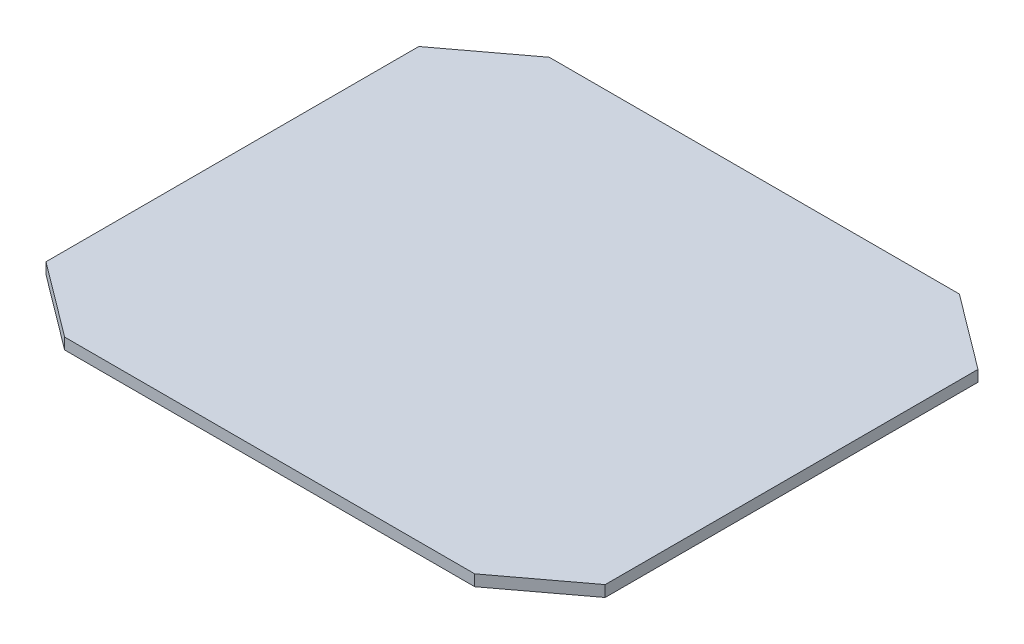
ISO-10303-21;
HEADER;
FILE_DESCRIPTION(('STEP AP214'),'2;1');
FILE_NAME('part.step','',(''),(''),'','','');
FILE_SCHEMA(('AUTOMOTIVE_DESIGN { 1 0 10303 214 1 1 1 1 }'));
ENDSEC;
DATA;
#1=APPLICATION_CONTEXT('core data for automotive mechanical design processes');
#2=APPLICATION_PROTOCOL_DEFINITION('international standard','automotive_design',2000,#1);
#3=PRODUCT_CONTEXT('',#1,'mechanical');
#4=PRODUCT('Part','Part','',(#3));
#5=PRODUCT_RELATED_PRODUCT_CATEGORY('part','',(#4));
#6=PRODUCT_DEFINITION_FORMATION('','',#4);
#7=PRODUCT_DEFINITION_CONTEXT('part definition',#1,'design');
#8=PRODUCT_DEFINITION('design','',#6,#7);
#9=PRODUCT_DEFINITION_SHAPE('','',#8);
#10=(LENGTH_UNIT() NAMED_UNIT(*) SI_UNIT(.MILLI.,.METRE.));
#11=(NAMED_UNIT(*) PLANE_ANGLE_UNIT() SI_UNIT($,.RADIAN.));
#12=(NAMED_UNIT(*) SI_UNIT($,.STERADIAN.) SOLID_ANGLE_UNIT());
#13=UNCERTAINTY_MEASURE_WITH_UNIT(LENGTH_MEASURE(1.E-05),#10,'distance_accuracy_value','');
#14=(GEOMETRIC_REPRESENTATION_CONTEXT(3) GLOBAL_UNCERTAINTY_ASSIGNED_CONTEXT((#13)) GLOBAL_UNIT_ASSIGNED_CONTEXT((#10,
#11,#12)) REPRESENTATION_CONTEXT('',''));
#15=CARTESIAN_POINT('',(0.,0.,0.));
#16=DIRECTION('',(0.,0.,1.));
#17=DIRECTION('',(1.,0.,0.));
#18=AXIS2_PLACEMENT_3D('',#15,#16,#17);
#19=CARTESIAN_POINT('',(75.,3.,-65.));
#20=DIRECTION('',(-1.,0.,0.));
#21=DIRECTION('',(0.,0.,1.));
#22=AXIS2_PLACEMENT_3D('',#19,#20,#21);
#23=PLANE('',#22);
#24=DIRECTION('',(0.,0.,-1.));
#25=VECTOR('',#24,1.);
#26=CARTESIAN_POINT('',(75.,0.,-65.));
#27=LINE('',#26,#25);
#28=CARTESIAN_POINT('',(75.,0.,50.));
#29=VERTEX_POINT('',#28);
#30=CARTESIAN_POINT('',(75.,0.,-50.));
#31=VERTEX_POINT('',#30);
#32=EDGE_CURVE('E130',#29,#31,#27,.T.);
#33=ORIENTED_EDGE('',*,*,#32,.T.);
#34=DIRECTION('',(0.,1.,0.));
#35=VECTOR('',#34,1.);
#36=CARTESIAN_POINT('',(75.,0.,-50.));
#37=LINE('',#36,#35);
#38=CARTESIAN_POINT('',(75.,3.,-50.));
#39=VERTEX_POINT('',#38);
#40=EDGE_CURVE('E148',#31,#39,#37,.T.);
#41=ORIENTED_EDGE('',*,*,#40,.T.);
#42=DIRECTION('',(0.,0.,-1.));
#43=VECTOR('',#42,1.);
#44=CARTESIAN_POINT('',(75.,3.,-65.));
#45=LINE('',#44,#43);
#46=CARTESIAN_POINT('',(75.,3.,50.));
#47=VERTEX_POINT('',#46);
#48=EDGE_CURVE('E121',#47,#39,#45,.T.);
#49=ORIENTED_EDGE('',*,*,#48,.F.);
#50=DIRECTION('',(0.,1.,0.));
#51=VECTOR('',#50,1.);
#52=CARTESIAN_POINT('',(75.,0.,50.));
#53=LINE('',#52,#51);
#54=EDGE_CURVE('E157',#29,#47,#53,.T.);
#55=ORIENTED_EDGE('',*,*,#54,.F.);
#56=EDGE_LOOP('',(#33,#41,#49,#55));
#57=FACE_BOUND('',#56,.T.);
#58=ADVANCED_FACE('F36',(#57),#23,.F.);
#59=CARTESIAN_POINT('',(-75.,3.,-65.));
#60=DIRECTION('',(0.,0.,1.));
#61=DIRECTION('',(1.,0.,0.));
#62=AXIS2_PLACEMENT_3D('',#59,#60,#61);
#63=PLANE('',#62);
#64=DIRECTION('',(-1.,0.,0.));
#65=VECTOR('',#64,1.);
#66=CARTESIAN_POINT('',(-75.,3.,-65.));
#67=LINE('',#66,#65);
#68=CARTESIAN_POINT('',(55.,3.,-65.));
#69=VERTEX_POINT('',#68);
#70=CARTESIAN_POINT('',(-55.,3.,-65.));
#71=VERTEX_POINT('',#70);
#72=EDGE_CURVE('E124',#69,#71,#67,.T.);
#73=ORIENTED_EDGE('',*,*,#72,.F.);
#74=DIRECTION('',(0.,1.,0.));
#75=VECTOR('',#74,1.);
#76=CARTESIAN_POINT('',(55.,0.,-65.));
#77=LINE('',#76,#75);
#78=CARTESIAN_POINT('',(55.,0.,-65.));
#79=VERTEX_POINT('',#78);
#80=EDGE_CURVE('E146',#79,#69,#77,.T.);
#81=ORIENTED_EDGE('',*,*,#80,.F.);
#82=DIRECTION('',(-1.,0.,0.));
#83=VECTOR('',#82,1.);
#84=CARTESIAN_POINT('',(-75.,0.,-65.));
#85=LINE('',#84,#83);
#86=CARTESIAN_POINT('',(-55.,0.,-65.));
#87=VERTEX_POINT('',#86);
#88=EDGE_CURVE('E126',#79,#87,#85,.T.);
#89=ORIENTED_EDGE('',*,*,#88,.T.);
#90=DIRECTION('',(0.,1.,0.));
#91=VECTOR('',#90,1.);
#92=CARTESIAN_POINT('',(-55.,0.,-65.));
#93=LINE('',#92,#91);
#94=EDGE_CURVE('E52',#87,#71,#93,.T.);
#95=ORIENTED_EDGE('',*,*,#94,.T.);
#96=EDGE_LOOP('',(#73,#81,#89,#95));
#97=FACE_BOUND('',#96,.T.);
#98=ADVANCED_FACE('F173',(#97),#63,.F.);
#99=CARTESIAN_POINT('',(-75.,3.,-65.));
#100=DIRECTION('',(1.,0.,0.));
#101=DIRECTION('',(0.,0.,-1.));
#102=AXIS2_PLACEMENT_3D('',#99,#100,#101);
#103=PLANE('',#102);
#104=DIRECTION('',(0.,0.,1.));
#105=VECTOR('',#104,1.);
#106=CARTESIAN_POINT('',(-75.,0.,-65.));
#107=LINE('',#106,#105);
#108=CARTESIAN_POINT('',(-75.,0.,-50.));
#109=VERTEX_POINT('',#108);
#110=CARTESIAN_POINT('',(-75.,0.,50.));
#111=VERTEX_POINT('',#110);
#112=EDGE_CURVE('E122',#109,#111,#107,.T.);
#113=ORIENTED_EDGE('',*,*,#112,.T.);
#114=DIRECTION('',(0.,1.,0.));
#115=VECTOR('',#114,1.);
#116=CARTESIAN_POINT('',(-75.,0.,50.));
#117=LINE('',#116,#115);
#118=CARTESIAN_POINT('',(-75.,3.,50.));
#119=VERTEX_POINT('',#118);
#120=EDGE_CURVE('E60',#111,#119,#117,.T.);
#121=ORIENTED_EDGE('',*,*,#120,.T.);
#122=DIRECTION('',(0.,0.,1.));
#123=VECTOR('',#122,1.);
#124=CARTESIAN_POINT('',(-75.,3.,-65.));
#125=LINE('',#124,#123);
#126=CARTESIAN_POINT('',(-75.,3.,-50.));
#127=VERTEX_POINT('',#126);
#128=EDGE_CURVE('E44',#127,#119,#125,.T.);
#129=ORIENTED_EDGE('',*,*,#128,.F.);
#130=DIRECTION('',(0.,1.,0.));
#131=VECTOR('',#130,1.);
#132=CARTESIAN_POINT('',(-75.,0.,-50.));
#133=LINE('',#132,#131);
#134=EDGE_CURVE('E139',#109,#127,#133,.T.);
#135=ORIENTED_EDGE('',*,*,#134,.F.);
#136=EDGE_LOOP('',(#113,#121,#129,#135));
#137=FACE_BOUND('',#136,.T.);
#138=ADVANCED_FACE('F166',(#137),#103,.F.);
#139=CARTESIAN_POINT('',(-75.,3.,65.));
#140=DIRECTION('',(0.,0.,-1.));
#141=DIRECTION('',(-1.,0.,0.));
#142=AXIS2_PLACEMENT_3D('',#139,#140,#141);
#143=PLANE('',#142);
#144=DIRECTION('',(1.,0.,0.));
#145=VECTOR('',#144,1.);
#146=CARTESIAN_POINT('',(-75.,0.,65.));
#147=LINE('',#146,#145);
#148=CARTESIAN_POINT('',(-55.,0.,65.));
#149=VERTEX_POINT('',#148);
#150=CARTESIAN_POINT('',(55.,0.,65.));
#151=VERTEX_POINT('',#150);
#152=EDGE_CURVE('E39',#149,#151,#147,.T.);
#153=ORIENTED_EDGE('',*,*,#152,.T.);
#154=DIRECTION('',(0.,1.,0.));
#155=VECTOR('',#154,1.);
#156=CARTESIAN_POINT('',(55.,0.,65.));
#157=LINE('',#156,#155);
#158=CARTESIAN_POINT('',(55.,3.,65.));
#159=VERTEX_POINT('',#158);
#160=EDGE_CURVE('E159',#151,#159,#157,.T.);
#161=ORIENTED_EDGE('',*,*,#160,.T.);
#162=DIRECTION('',(1.,0.,0.));
#163=VECTOR('',#162,1.);
#164=CARTESIAN_POINT('',(-75.,3.,65.));
#165=LINE('',#164,#163);
#166=CARTESIAN_POINT('',(-55.,3.,65.));
#167=VERTEX_POINT('',#166);
#168=EDGE_CURVE('E11',#167,#159,#165,.T.);
#169=ORIENTED_EDGE('',*,*,#168,.F.);
#170=DIRECTION('',(0.,1.,0.));
#171=VECTOR('',#170,1.);
#172=CARTESIAN_POINT('',(-55.,0.,65.));
#173=LINE('',#172,#171);
#174=EDGE_CURVE('E102',#149,#167,#173,.T.);
#175=ORIENTED_EDGE('',*,*,#174,.F.);
#176=EDGE_LOOP('',(#153,#161,#169,#175));
#177=FACE_BOUND('',#176,.T.);
#178=ADVANCED_FACE('F113',(#177),#143,.F.);
#179=CARTESIAN_POINT('',(0.,3.,0.));
#180=DIRECTION('',(0.,1.,0.));
#181=DIRECTION('',(0.,0.,1.));
#182=AXIS2_PLACEMENT_3D('',#179,#180,#181);
#183=PLANE('',#182);
#184=DIRECTION('',(0.8,0.,0.6));
#185=VECTOR('',#184,1.);
#186=CARTESIAN_POINT('',(55.,3.,-65.));
#187=LINE('',#186,#185);
#188=EDGE_CURVE('E153',#69,#39,#187,.T.);
#189=ORIENTED_EDGE('',*,*,#188,.F.);
#190=ORIENTED_EDGE('',*,*,#72,.T.);
#191=DIRECTION('',(0.8,0.,-0.6));
#192=VECTOR('',#191,1.);
#193=CARTESIAN_POINT('',(-55.,3.,-65.));
#194=LINE('',#193,#192);
#195=EDGE_CURVE('E143',#127,#71,#194,.T.);
#196=ORIENTED_EDGE('',*,*,#195,.F.);
#197=ORIENTED_EDGE('',*,*,#128,.T.);
#198=DIRECTION('',(-0.8,0.,-0.6));
#199=VECTOR('',#198,1.);
#200=CARTESIAN_POINT('',(-75.,3.,50.));
#201=LINE('',#200,#199);
#202=EDGE_CURVE('E108',#167,#119,#201,.T.);
#203=ORIENTED_EDGE('',*,*,#202,.F.);
#204=ORIENTED_EDGE('',*,*,#168,.T.);
#205=DIRECTION('',(-0.8,0.,0.6));
#206=VECTOR('',#205,1.);
#207=CARTESIAN_POINT('',(75.,3.,50.));
#208=LINE('',#207,#206);
#209=EDGE_CURVE('E152',#47,#159,#208,.T.);
#210=ORIENTED_EDGE('',*,*,#209,.F.);
#211=ORIENTED_EDGE('',*,*,#48,.T.);
#212=EDGE_LOOP('',(#189,#190,#196,#197,#203,#204,#210,#211));
#213=FACE_BOUND('',#212,.T.);
#214=ADVANCED_FACE('F169',(#213),#183,.T.);
#215=CARTESIAN_POINT('',(0.,0.,0.));
#216=DIRECTION('',(0.,1.,0.));
#217=DIRECTION('',(0.,0.,1.));
#218=AXIS2_PLACEMENT_3D('',#215,#216,#217);
#219=PLANE('',#218);
#220=ORIENTED_EDGE('',*,*,#88,.F.);
#221=DIRECTION('',(0.8,0.,0.6));
#222=VECTOR('',#221,1.);
#223=CARTESIAN_POINT('',(55.,0.,-65.));
#224=LINE('',#223,#222);
#225=EDGE_CURVE('E149',#79,#31,#224,.T.);
#226=ORIENTED_EDGE('',*,*,#225,.T.);
#227=ORIENTED_EDGE('',*,*,#32,.F.);
#228=DIRECTION('',(-0.8,0.,0.6));
#229=VECTOR('',#228,1.);
#230=CARTESIAN_POINT('',(75.,0.,50.));
#231=LINE('',#230,#229);
#232=EDGE_CURVE('E120',#29,#151,#231,.T.);
#233=ORIENTED_EDGE('',*,*,#232,.T.);
#234=ORIENTED_EDGE('',*,*,#152,.F.);
#235=DIRECTION('',(-0.8,0.,-0.6));
#236=VECTOR('',#235,1.);
#237=CARTESIAN_POINT('',(-75.,0.,50.));
#238=LINE('',#237,#236);
#239=EDGE_CURVE('E99',#149,#111,#238,.T.);
#240=ORIENTED_EDGE('',*,*,#239,.T.);
#241=ORIENTED_EDGE('',*,*,#112,.F.);
#242=DIRECTION('',(0.8,0.,-0.6));
#243=VECTOR('',#242,1.);
#244=CARTESIAN_POINT('',(-55.,0.,-65.));
#245=LINE('',#244,#243);
#246=EDGE_CURVE('E141',#109,#87,#245,.T.);
#247=ORIENTED_EDGE('',*,*,#246,.T.);
#248=EDGE_LOOP('',(#220,#226,#227,#233,#234,#240,#241,#247));
#249=FACE_BOUND('',#248,.T.);
#250=ADVANCED_FACE('F118',(#249),#219,.F.);
#251=CARTESIAN_POINT('',(-55.,0.,-65.));
#252=DIRECTION('',(0.6,0.,0.8));
#253=DIRECTION('',(0.8,0.,-0.6));
#254=AXIS2_PLACEMENT_3D('',#251,#252,#253);
#255=PLANE('',#254);
#256=ORIENTED_EDGE('',*,*,#195,.T.);
#257=ORIENTED_EDGE('',*,*,#94,.F.);
#258=ORIENTED_EDGE('',*,*,#246,.F.);
#259=ORIENTED_EDGE('',*,*,#134,.T.);
#260=EDGE_LOOP('',(#256,#257,#258,#259));
#261=FACE_BOUND('',#260,.T.);
#262=ADVANCED_FACE('F171',(#261),#255,.F.);
#263=CARTESIAN_POINT('',(-75.,0.,50.));
#264=DIRECTION('',(0.6,0.,-0.8));
#265=DIRECTION('',(-0.8,0.,-0.6));
#266=AXIS2_PLACEMENT_3D('',#263,#264,#265);
#267=PLANE('',#266);
#268=ORIENTED_EDGE('',*,*,#202,.T.);
#269=ORIENTED_EDGE('',*,*,#120,.F.);
#270=ORIENTED_EDGE('',*,*,#239,.F.);
#271=ORIENTED_EDGE('',*,*,#174,.T.);
#272=EDGE_LOOP('',(#268,#269,#270,#271));
#273=FACE_BOUND('',#272,.T.);
#274=ADVANCED_FACE('F101',(#273),#267,.F.);
#275=CARTESIAN_POINT('',(75.,0.,50.));
#276=DIRECTION('',(-0.6,0.,-0.8));
#277=DIRECTION('',(-0.8,0.,0.6));
#278=AXIS2_PLACEMENT_3D('',#275,#276,#277);
#279=PLANE('',#278);
#280=ORIENTED_EDGE('',*,*,#209,.T.);
#281=ORIENTED_EDGE('',*,*,#160,.F.);
#282=ORIENTED_EDGE('',*,*,#232,.F.);
#283=ORIENTED_EDGE('',*,*,#54,.T.);
#284=EDGE_LOOP('',(#280,#281,#282,#283));
#285=FACE_BOUND('',#284,.T.);
#286=ADVANCED_FACE('F181',(#285),#279,.F.);
#287=CARTESIAN_POINT('',(55.,0.,-65.));
#288=DIRECTION('',(-0.6,0.,0.8));
#289=DIRECTION('',(0.8,0.,0.6));
#290=AXIS2_PLACEMENT_3D('',#287,#288,#289);
#291=PLANE('',#290);
#292=ORIENTED_EDGE('',*,*,#188,.T.);
#293=ORIENTED_EDGE('',*,*,#40,.F.);
#294=ORIENTED_EDGE('',*,*,#225,.F.);
#295=ORIENTED_EDGE('',*,*,#80,.T.);
#296=EDGE_LOOP('',(#292,#293,#294,#295));
#297=FACE_BOUND('',#296,.T.);
#298=ADVANCED_FACE('F182',(#297),#291,.F.);
#299=CLOSED_SHELL('',(#58,#98,#138,#178,#214,#250,#262,#274,#286,#298));
#300=MANIFOLD_SOLID_BREP('B2',#299);
#301=ADVANCED_BREP_SHAPE_REPRESENTATION('',(#18,#300),#14);
#302=SHAPE_DEFINITION_REPRESENTATION(#9,#301);
ENDSEC;
END-ISO-10303-21;
